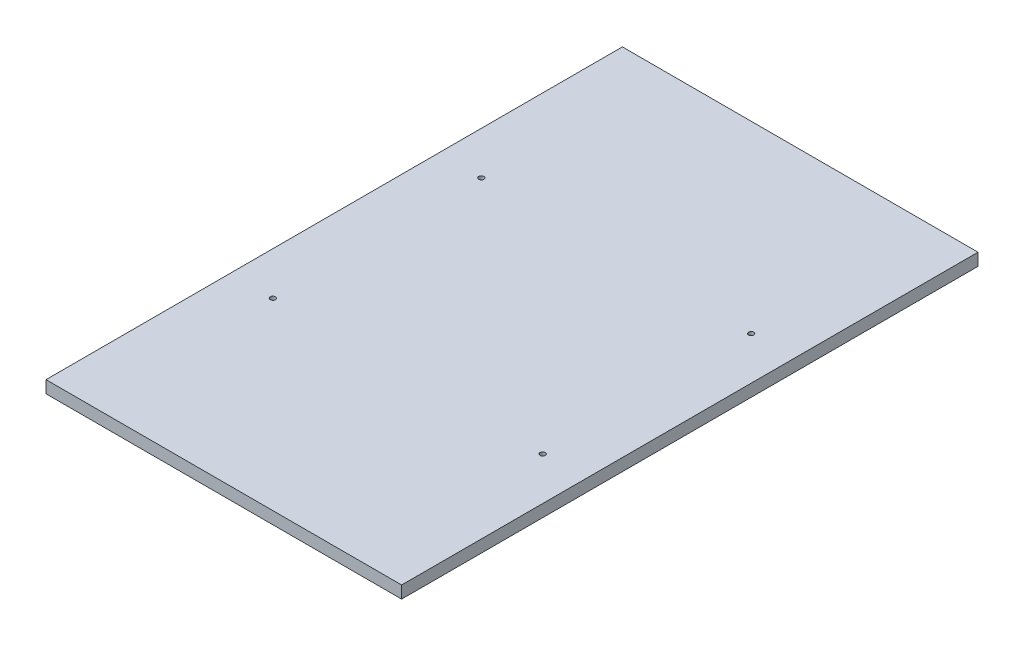
ISO-10303-21;
HEADER;
FILE_DESCRIPTION(('STEP AP214'),'2;1');
FILE_NAME('part.step','',(''),(''),'','','');
FILE_SCHEMA(('AUTOMOTIVE_DESIGN { 1 0 10303 214 1 1 1 1 }'));
ENDSEC;
DATA;
#1=APPLICATION_CONTEXT('core data for automotive mechanical design processes');
#2=APPLICATION_PROTOCOL_DEFINITION('international standard','automotive_design',2000,#1);
#3=PRODUCT_CONTEXT('',#1,'mechanical');
#4=PRODUCT('Part','Part','',(#3));
#5=PRODUCT_RELATED_PRODUCT_CATEGORY('part','',(#4));
#6=PRODUCT_DEFINITION_FORMATION('','',#4);
#7=PRODUCT_DEFINITION_CONTEXT('part definition',#1,'design');
#8=PRODUCT_DEFINITION('design','',#6,#7);
#9=PRODUCT_DEFINITION_SHAPE('','',#8);
#10=(LENGTH_UNIT() NAMED_UNIT(*) SI_UNIT(.MILLI.,.METRE.));
#11=(NAMED_UNIT(*) PLANE_ANGLE_UNIT() SI_UNIT($,.RADIAN.));
#12=(NAMED_UNIT(*) SI_UNIT($,.STERADIAN.) SOLID_ANGLE_UNIT());
#13=UNCERTAINTY_MEASURE_WITH_UNIT(LENGTH_MEASURE(1.E-05),#10,'distance_accuracy_value','');
#14=(GEOMETRIC_REPRESENTATION_CONTEXT(3) GLOBAL_UNCERTAINTY_ASSIGNED_CONTEXT((#13)) GLOBAL_UNIT_ASSIGNED_CONTEXT((#10,
#11,#12)) REPRESENTATION_CONTEXT('',''));
#15=CARTESIAN_POINT('',(0.,0.,0.));
#16=DIRECTION('',(0.,0.,1.));
#17=DIRECTION('',(1.,0.,0.));
#18=AXIS2_PLACEMENT_3D('',#15,#16,#17);
#19=CARTESIAN_POINT('',(-145.,10.,-200.));
#20=DIRECTION('',(1.,0.,0.));
#21=DIRECTION('',(0.,0.,-1.));
#22=AXIS2_PLACEMENT_3D('',#19,#20,#21);
#23=PLANE('',#22);
#24=DIRECTION('',(0.,0.,1.));
#25=VECTOR('',#24,1.);
#26=CARTESIAN_POINT('',(-145.,0.,-200.));
#27=LINE('',#26,#25);
#28=CARTESIAN_POINT('',(-145.,0.,-200.));
#29=VERTEX_POINT('',#28);
#30=CARTESIAN_POINT('',(-145.,0.,270.));
#31=VERTEX_POINT('',#30);
#32=EDGE_CURVE('E98',#29,#31,#27,.T.);
#33=ORIENTED_EDGE('',*,*,#32,.T.);
#34=DIRECTION('',(0.,-1.,0.));
#35=VECTOR('',#34,1.);
#36=CARTESIAN_POINT('',(-145.,10.,270.));
#37=LINE('',#36,#35);
#38=CARTESIAN_POINT('',(-145.,10.,270.));
#39=VERTEX_POINT('',#38);
#40=EDGE_CURVE('E11',#39,#31,#37,.T.);
#41=ORIENTED_EDGE('',*,*,#40,.F.);
#42=DIRECTION('',(0.,0.,1.));
#43=VECTOR('',#42,1.);
#44=CARTESIAN_POINT('',(-145.,10.,-200.));
#45=LINE('',#44,#43);
#46=CARTESIAN_POINT('',(-145.,10.,-200.));
#47=VERTEX_POINT('',#46);
#48=EDGE_CURVE('E86',#47,#39,#45,.T.);
#49=ORIENTED_EDGE('',*,*,#48,.F.);
#50=DIRECTION('',(0.,-1.,0.));
#51=VECTOR('',#50,1.);
#52=CARTESIAN_POINT('',(-145.,10.,-200.));
#53=LINE('',#52,#51);
#54=EDGE_CURVE('E94',#47,#29,#53,.T.);
#55=ORIENTED_EDGE('',*,*,#54,.T.);
#56=EDGE_LOOP('',(#33,#41,#49,#55));
#57=FACE_BOUND('',#56,.T.);
#58=ADVANCED_FACE('F35',(#57),#23,.F.);
#59=CARTESIAN_POINT('',(-145.,10.,270.));
#60=DIRECTION('',(0.,0.,-1.));
#61=DIRECTION('',(-1.,0.,0.));
#62=AXIS2_PLACEMENT_3D('',#59,#60,#61);
#63=PLANE('',#62);
#64=DIRECTION('',(1.,0.,0.));
#65=VECTOR('',#64,1.);
#66=CARTESIAN_POINT('',(-145.,0.,270.));
#67=LINE('',#66,#65);
#68=CARTESIAN_POINT('',(145.,0.,270.));
#69=VERTEX_POINT('',#68);
#70=EDGE_CURVE('E90',#31,#69,#67,.T.);
#71=ORIENTED_EDGE('',*,*,#70,.T.);
#72=DIRECTION('',(0.,-1.,0.));
#73=VECTOR('',#72,1.);
#74=CARTESIAN_POINT('',(145.,10.,270.));
#75=LINE('',#74,#73);
#76=CARTESIAN_POINT('',(145.,10.,270.));
#77=VERTEX_POINT('',#76);
#78=EDGE_CURVE('E43',#77,#69,#75,.T.);
#79=ORIENTED_EDGE('',*,*,#78,.F.);
#80=DIRECTION('',(1.,0.,0.));
#81=VECTOR('',#80,1.);
#82=CARTESIAN_POINT('',(-145.,10.,270.));
#83=LINE('',#82,#81);
#84=EDGE_CURVE('E81',#39,#77,#83,.T.);
#85=ORIENTED_EDGE('',*,*,#84,.F.);
#86=ORIENTED_EDGE('',*,*,#40,.T.);
#87=EDGE_LOOP('',(#71,#79,#85,#86));
#88=FACE_BOUND('',#87,.T.);
#89=ADVANCED_FACE('F89',(#88),#63,.F.);
#90=CARTESIAN_POINT('',(145.,10.,-200.));
#91=DIRECTION('',(-1.,0.,0.));
#92=DIRECTION('',(0.,0.,1.));
#93=AXIS2_PLACEMENT_3D('',#90,#91,#92);
#94=PLANE('',#93);
#95=DIRECTION('',(0.,0.,-1.));
#96=VECTOR('',#95,1.);
#97=CARTESIAN_POINT('',(145.,0.,-200.));
#98=LINE('',#97,#96);
#99=CARTESIAN_POINT('',(145.,0.,-200.));
#100=VERTEX_POINT('',#99);
#101=EDGE_CURVE('E68',#69,#100,#98,.T.);
#102=ORIENTED_EDGE('',*,*,#101,.T.);
#103=DIRECTION('',(0.,-1.,0.));
#104=VECTOR('',#103,1.);
#105=CARTESIAN_POINT('',(145.,10.,-200.));
#106=LINE('',#105,#104);
#107=CARTESIAN_POINT('',(145.,10.,-200.));
#108=VERTEX_POINT('',#107);
#109=EDGE_CURVE('E91',#108,#100,#106,.T.);
#110=ORIENTED_EDGE('',*,*,#109,.F.);
#111=DIRECTION('',(0.,0.,-1.));
#112=VECTOR('',#111,1.);
#113=CARTESIAN_POINT('',(145.,10.,-200.));
#114=LINE('',#113,#112);
#115=EDGE_CURVE('E84',#77,#108,#114,.T.);
#116=ORIENTED_EDGE('',*,*,#115,.F.);
#117=ORIENTED_EDGE('',*,*,#78,.T.);
#118=EDGE_LOOP('',(#102,#110,#116,#117));
#119=FACE_BOUND('',#118,.T.);
#120=ADVANCED_FACE('F92',(#119),#94,.F.);
#121=CARTESIAN_POINT('',(145.,10.,-200.));
#122=DIRECTION('',(0.,0.,1.));
#123=DIRECTION('',(1.,0.,0.));
#124=AXIS2_PLACEMENT_3D('',#121,#122,#123);
#125=PLANE('',#124);
#126=DIRECTION('',(-1.,0.,0.));
#127=VECTOR('',#126,1.);
#128=CARTESIAN_POINT('',(145.,0.,-200.));
#129=LINE('',#128,#127);
#130=EDGE_CURVE('E74',#100,#29,#129,.T.);
#131=ORIENTED_EDGE('',*,*,#130,.T.);
#132=ORIENTED_EDGE('',*,*,#54,.F.);
#133=DIRECTION('',(-1.,0.,0.));
#134=VECTOR('',#133,1.);
#135=CARTESIAN_POINT('',(145.,10.,-200.));
#136=LINE('',#135,#134);
#137=EDGE_CURVE('E51',#108,#47,#136,.T.);
#138=ORIENTED_EDGE('',*,*,#137,.F.);
#139=ORIENTED_EDGE('',*,*,#109,.T.);
#140=EDGE_LOOP('',(#131,#132,#138,#139));
#141=FACE_BOUND('',#140,.T.);
#142=ADVANCED_FACE('F106',(#141),#125,.F.);
#143=CARTESIAN_POINT('',(0.,10.,0.));
#144=DIRECTION('',(0.,1.,0.));
#145=DIRECTION('',(0.,0.,1.));
#146=AXIS2_PLACEMENT_3D('',#143,#144,#145);
#147=PLANE('',#146);
#148=CARTESIAN_POINT('',(-110.,10.,-50.));
#149=DIRECTION('',(0.,1.,0.));
#150=DIRECTION('',(0.,0.,1.));
#151=AXIS2_PLACEMENT_3D('',#148,#149,#150);
#152=CIRCLE('',#151,2.1);
#153=CARTESIAN_POINT('',(-110.,10.,-47.9));
#154=VERTEX_POINT('',#153);
#155=EDGE_CURVE('E132',#154,#154,#152,.T.);
#156=ORIENTED_EDGE('',*,*,#155,.F.);
#157=EDGE_LOOP('',(#156));
#158=FACE_BOUND('',#157,.T.);
#159=CARTESIAN_POINT('',(110.,10.,-50.));
#160=DIRECTION('',(0.,1.,0.));
#161=DIRECTION('',(0.,0.,1.));
#162=AXIS2_PLACEMENT_3D('',#159,#160,#161);
#163=CIRCLE('',#162,2.1);
#164=CARTESIAN_POINT('',(110.,10.,-47.9));
#165=VERTEX_POINT('',#164);
#166=EDGE_CURVE('E126',#165,#165,#163,.T.);
#167=ORIENTED_EDGE('',*,*,#166,.F.);
#168=EDGE_LOOP('',(#167));
#169=FACE_BOUND('',#168,.T.);
#170=CARTESIAN_POINT('',(110.,10.,120.));
#171=DIRECTION('',(0.,1.,0.));
#172=DIRECTION('',(0.,0.,1.));
#173=AXIS2_PLACEMENT_3D('',#170,#171,#172);
#174=CIRCLE('',#173,2.1);
#175=CARTESIAN_POINT('',(110.,10.,122.1));
#176=VERTEX_POINT('',#175);
#177=EDGE_CURVE('E120',#176,#176,#174,.T.);
#178=ORIENTED_EDGE('',*,*,#177,.F.);
#179=EDGE_LOOP('',(#178));
#180=FACE_BOUND('',#179,.T.);
#181=CARTESIAN_POINT('',(-110.,10.,120.));
#182=DIRECTION('',(0.,1.,0.));
#183=DIRECTION('',(0.,0.,1.));
#184=AXIS2_PLACEMENT_3D('',#181,#182,#183);
#185=CIRCLE('',#184,2.1);
#186=CARTESIAN_POINT('',(-110.,10.,122.1));
#187=VERTEX_POINT('',#186);
#188=EDGE_CURVE('E114',#187,#187,#185,.T.);
#189=ORIENTED_EDGE('',*,*,#188,.F.);
#190=EDGE_LOOP('',(#189));
#191=FACE_BOUND('',#190,.T.);
#192=ORIENTED_EDGE('',*,*,#48,.T.);
#193=ORIENTED_EDGE('',*,*,#84,.T.);
#194=ORIENTED_EDGE('',*,*,#115,.T.);
#195=ORIENTED_EDGE('',*,*,#137,.T.);
#196=EDGE_LOOP('',(#192,#193,#194,#195));
#197=FACE_BOUND('',#196,.T.);
#198=ADVANCED_FACE('F82',(#158,#169,#180,#191,#197),#147,.T.);
#199=CARTESIAN_POINT('',(0.,0.,0.));
#200=DIRECTION('',(0.,1.,0.));
#201=DIRECTION('',(0.,0.,1.));
#202=AXIS2_PLACEMENT_3D('',#199,#200,#201);
#203=PLANE('',#202);
#204=CARTESIAN_POINT('',(-110.,0.,-50.));
#205=DIRECTION('',(0.,1.,0.));
#206=DIRECTION('',(0.,0.,1.));
#207=AXIS2_PLACEMENT_3D('',#204,#205,#206);
#208=CIRCLE('',#207,2.1);
#209=CARTESIAN_POINT('',(-110.,0.,-47.9));
#210=VERTEX_POINT('',#209);
#211=EDGE_CURVE('E129',#210,#210,#208,.T.);
#212=ORIENTED_EDGE('',*,*,#211,.T.);
#213=EDGE_LOOP('',(#212));
#214=FACE_BOUND('',#213,.T.);
#215=CARTESIAN_POINT('',(110.,0.,-50.));
#216=DIRECTION('',(0.,1.,0.));
#217=DIRECTION('',(0.,0.,1.));
#218=AXIS2_PLACEMENT_3D('',#215,#216,#217);
#219=CIRCLE('',#218,2.1);
#220=CARTESIAN_POINT('',(110.,0.,-47.9));
#221=VERTEX_POINT('',#220);
#222=EDGE_CURVE('E123',#221,#221,#219,.T.);
#223=ORIENTED_EDGE('',*,*,#222,.T.);
#224=EDGE_LOOP('',(#223));
#225=FACE_BOUND('',#224,.T.);
#226=CARTESIAN_POINT('',(110.,0.,120.));
#227=DIRECTION('',(0.,1.,0.));
#228=DIRECTION('',(0.,0.,1.));
#229=AXIS2_PLACEMENT_3D('',#226,#227,#228);
#230=CIRCLE('',#229,2.1);
#231=CARTESIAN_POINT('',(110.,0.,122.1));
#232=VERTEX_POINT('',#231);
#233=EDGE_CURVE('E117',#232,#232,#230,.T.);
#234=ORIENTED_EDGE('',*,*,#233,.T.);
#235=EDGE_LOOP('',(#234));
#236=FACE_BOUND('',#235,.T.);
#237=CARTESIAN_POINT('',(-110.,0.,120.));
#238=DIRECTION('',(0.,1.,0.));
#239=DIRECTION('',(0.,0.,1.));
#240=AXIS2_PLACEMENT_3D('',#237,#238,#239);
#241=CIRCLE('',#240,2.1);
#242=CARTESIAN_POINT('',(-110.,0.,122.1));
#243=VERTEX_POINT('',#242);
#244=EDGE_CURVE('E101',#243,#243,#241,.T.);
#245=ORIENTED_EDGE('',*,*,#244,.T.);
#246=EDGE_LOOP('',(#245));
#247=FACE_BOUND('',#246,.T.);
#248=ORIENTED_EDGE('',*,*,#32,.F.);
#249=ORIENTED_EDGE('',*,*,#130,.F.);
#250=ORIENTED_EDGE('',*,*,#101,.F.);
#251=ORIENTED_EDGE('',*,*,#70,.F.);
#252=EDGE_LOOP('',(#248,#249,#250,#251));
#253=FACE_BOUND('',#252,.T.);
#254=ADVANCED_FACE('F109',(#214,#225,#236,#247,#253),#203,.F.);
#255=CARTESIAN_POINT('',(-110.,10.,120.));
#256=DIRECTION('',(0.,1.,0.));
#257=DIRECTION('',(0.,0.,1.));
#258=AXIS2_PLACEMENT_3D('',#255,#256,#257);
#259=CYLINDRICAL_SURFACE('',#258,2.1);
#260=ORIENTED_EDGE('',*,*,#244,.F.);
#261=EDGE_LOOP('',(#260));
#262=FACE_BOUND('',#261,.T.);
#263=ORIENTED_EDGE('',*,*,#188,.T.);
#264=EDGE_LOOP('',(#263));
#265=FACE_BOUND('',#264,.T.);
#266=ADVANCED_FACE('F147',(#262,#265),#259,.F.);
#267=CARTESIAN_POINT('',(110.,10.,120.));
#268=DIRECTION('',(0.,1.,0.));
#269=DIRECTION('',(0.,0.,1.));
#270=AXIS2_PLACEMENT_3D('',#267,#268,#269);
#271=CYLINDRICAL_SURFACE('',#270,2.1);
#272=ORIENTED_EDGE('',*,*,#233,.F.);
#273=EDGE_LOOP('',(#272));
#274=FACE_BOUND('',#273,.T.);
#275=ORIENTED_EDGE('',*,*,#177,.T.);
#276=EDGE_LOOP('',(#275));
#277=FACE_BOUND('',#276,.T.);
#278=ADVANCED_FACE('F149',(#274,#277),#271,.F.);
#279=CARTESIAN_POINT('',(110.,10.,-50.));
#280=DIRECTION('',(0.,1.,0.));
#281=DIRECTION('',(0.,0.,1.));
#282=AXIS2_PLACEMENT_3D('',#279,#280,#281);
#283=CYLINDRICAL_SURFACE('',#282,2.1);
#284=ORIENTED_EDGE('',*,*,#222,.F.);
#285=EDGE_LOOP('',(#284));
#286=FACE_BOUND('',#285,.T.);
#287=ORIENTED_EDGE('',*,*,#166,.T.);
#288=EDGE_LOOP('',(#287));
#289=FACE_BOUND('',#288,.T.);
#290=ADVANCED_FACE('F156',(#286,#289),#283,.F.);
#291=CARTESIAN_POINT('',(-110.,10.,-50.));
#292=DIRECTION('',(0.,1.,0.));
#293=DIRECTION('',(0.,0.,1.));
#294=AXIS2_PLACEMENT_3D('',#291,#292,#293);
#295=CYLINDRICAL_SURFACE('',#294,2.1);
#296=ORIENTED_EDGE('',*,*,#211,.F.);
#297=EDGE_LOOP('',(#296));
#298=FACE_BOUND('',#297,.T.);
#299=ORIENTED_EDGE('',*,*,#155,.T.);
#300=EDGE_LOOP('',(#299));
#301=FACE_BOUND('',#300,.T.);
#302=ADVANCED_FACE('F136',(#298,#301),#295,.F.);
#303=CLOSED_SHELL('',(#58,#89,#120,#142,#198,#254,#266,#278,#290,#302));
#304=MANIFOLD_SOLID_BREP('B2',#303);
#305=ADVANCED_BREP_SHAPE_REPRESENTATION('',(#18,#304),#14);
#306=SHAPE_DEFINITION_REPRESENTATION(#9,#305);
ENDSEC;
END-ISO-10303-21;
